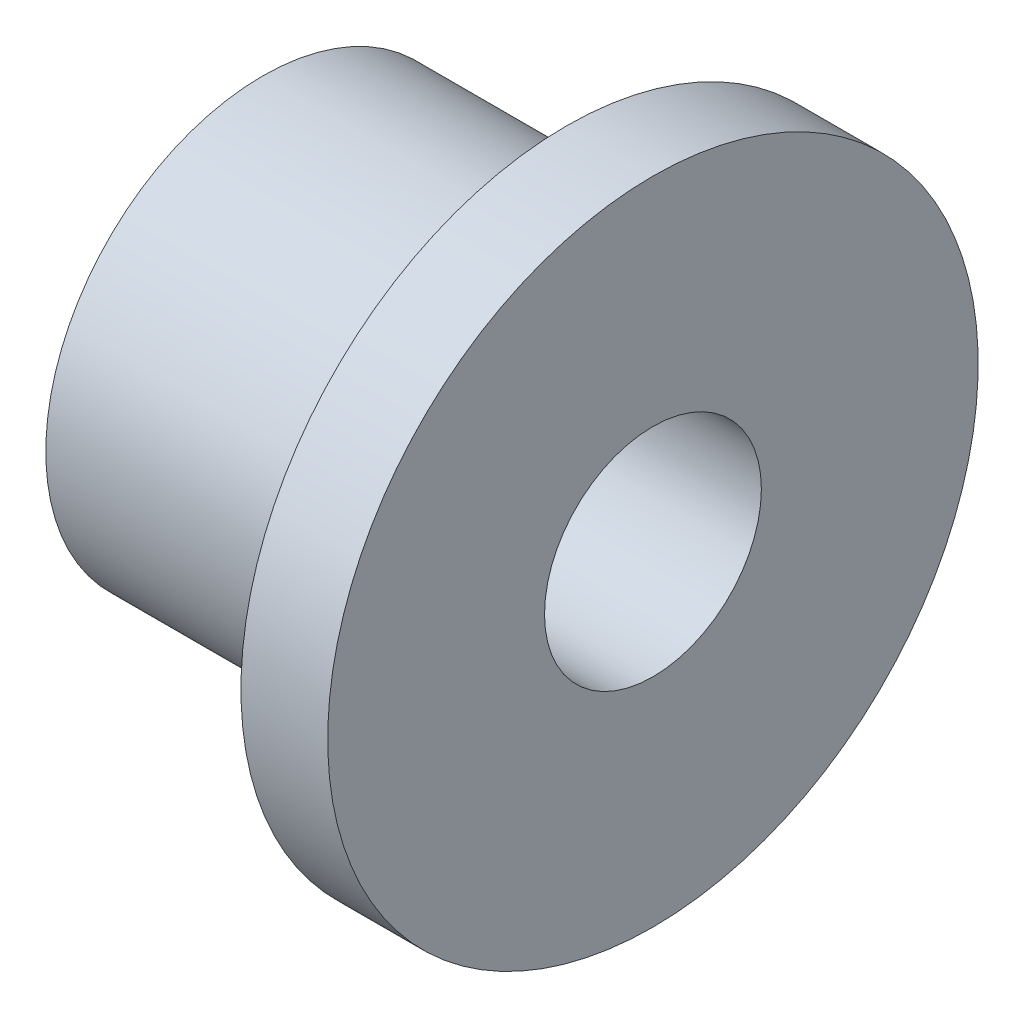
ISO-10303-21;
HEADER;
FILE_DESCRIPTION(('STEP AP214'),'2;1');
FILE_NAME('part.step','',(''),(''),'','','');
FILE_SCHEMA(('AUTOMOTIVE_DESIGN { 1 0 10303 214 1 1 1 1 }'));
ENDSEC;
DATA;
#1=APPLICATION_CONTEXT('core data for automotive mechanical design processes');
#2=APPLICATION_PROTOCOL_DEFINITION('international standard','automotive_design',2000,#1);
#3=PRODUCT_CONTEXT('',#1,'mechanical');
#4=PRODUCT('Part','Part','',(#3));
#5=PRODUCT_RELATED_PRODUCT_CATEGORY('part','',(#4));
#6=PRODUCT_DEFINITION_FORMATION('','',#4);
#7=PRODUCT_DEFINITION_CONTEXT('part definition',#1,'design');
#8=PRODUCT_DEFINITION('design','',#6,#7);
#9=PRODUCT_DEFINITION_SHAPE('','',#8);
#10=(LENGTH_UNIT() NAMED_UNIT(*) SI_UNIT(.MILLI.,.METRE.));
#11=(NAMED_UNIT(*) PLANE_ANGLE_UNIT() SI_UNIT($,.RADIAN.));
#12=(NAMED_UNIT(*) SI_UNIT($,.STERADIAN.) SOLID_ANGLE_UNIT());
#13=UNCERTAINTY_MEASURE_WITH_UNIT(LENGTH_MEASURE(1.E-05),#10,'distance_accuracy_value','');
#14=(GEOMETRIC_REPRESENTATION_CONTEXT(3) GLOBAL_UNCERTAINTY_ASSIGNED_CONTEXT((#13)) GLOBAL_UNIT_ASSIGNED_CONTEXT((#10,
#11,#12)) REPRESENTATION_CONTEXT('',''));
#15=CARTESIAN_POINT('',(0.,0.,0.));
#16=DIRECTION('',(0.,0.,1.));
#17=DIRECTION('',(1.,0.,0.));
#18=AXIS2_PLACEMENT_3D('',#15,#16,#17);
#19=CARTESIAN_POINT('',(35.,20.,0.));
#20=DIRECTION('',(-1.,0.,0.));
#21=DIRECTION('',(0.,-1.,0.));
#22=AXIS2_PLACEMENT_3D('',#19,#20,#21);
#23=PLANE('',#22);
#24=CARTESIAN_POINT('',(35.,20.,0.));
#25=DIRECTION('',(-1.,0.,0.));
#26=DIRECTION('',(0.,-1.,0.));
#27=AXIS2_PLACEMENT_3D('',#24,#25,#26);
#28=CIRCLE('',#27,7.5);
#29=CARTESIAN_POINT('',(35.,12.5,0.));
#30=VERTEX_POINT('',#29);
#31=EDGE_CURVE('E10',#30,#30,#28,.T.);
#32=ORIENTED_EDGE('',*,*,#31,.T.);
#33=EDGE_LOOP('',(#32));
#34=FACE_BOUND('',#33,.T.);
#35=CARTESIAN_POINT('',(35.,20.,0.));
#36=DIRECTION('',(-1.,0.,0.));
#37=DIRECTION('',(0.,-1.,0.));
#38=AXIS2_PLACEMENT_3D('',#35,#36,#37);
#39=CIRCLE('',#38,5.);
#40=CARTESIAN_POINT('',(35.,15.,0.));
#41=VERTEX_POINT('',#40);
#42=EDGE_CURVE('E47',#41,#41,#39,.T.);
#43=ORIENTED_EDGE('',*,*,#42,.F.);
#44=EDGE_LOOP('',(#43));
#45=FACE_BOUND('',#44,.T.);
#46=ADVANCED_FACE('F31',(#34,#45),#23,.T.);
#47=CARTESIAN_POINT('',(37.,20.,0.));
#48=DIRECTION('',(-1.,0.,0.));
#49=DIRECTION('',(0.,-1.,0.));
#50=AXIS2_PLACEMENT_3D('',#47,#48,#49);
#51=PLANE('',#50);
#52=CARTESIAN_POINT('',(37.,20.,0.));
#53=DIRECTION('',(-1.,0.,0.));
#54=DIRECTION('',(0.,-1.,0.));
#55=AXIS2_PLACEMENT_3D('',#52,#53,#54);
#56=CIRCLE('',#55,7.5);
#57=CARTESIAN_POINT('',(37.,12.5,0.));
#58=VERTEX_POINT('',#57);
#59=EDGE_CURVE('E35',#58,#58,#56,.T.);
#60=ORIENTED_EDGE('',*,*,#59,.F.);
#61=EDGE_LOOP('',(#60));
#62=FACE_BOUND('',#61,.T.);
#63=CARTESIAN_POINT('',(37.,20.,0.));
#64=DIRECTION('',(-1.,0.,0.));
#65=DIRECTION('',(0.,-1.,0.));
#66=AXIS2_PLACEMENT_3D('',#63,#64,#65);
#67=CIRCLE('',#66,2.5);
#68=CARTESIAN_POINT('',(37.,17.5,0.));
#69=VERTEX_POINT('',#68);
#70=EDGE_CURVE('E42',#69,#69,#67,.T.);
#71=ORIENTED_EDGE('',*,*,#70,.T.);
#72=EDGE_LOOP('',(#71));
#73=FACE_BOUND('',#72,.T.);
#74=ADVANCED_FACE('F72',(#62,#73),#51,.F.);
#75=CARTESIAN_POINT('',(35.,20.,0.));
#76=DIRECTION('',(1.,0.,0.));
#77=DIRECTION('',(0.,1.,0.));
#78=AXIS2_PLACEMENT_3D('',#75,#76,#77);
#79=CYLINDRICAL_SURFACE('',#78,7.5);
#80=ORIENTED_EDGE('',*,*,#31,.F.);
#81=EDGE_LOOP('',(#80));
#82=FACE_BOUND('',#81,.T.);
#83=ORIENTED_EDGE('',*,*,#59,.T.);
#84=EDGE_LOOP('',(#83));
#85=FACE_BOUND('',#84,.T.);
#86=ADVANCED_FACE('F33',(#82,#85),#79,.T.);
#87=CARTESIAN_POINT('',(35.,20.,0.));
#88=DIRECTION('',(1.,0.,0.));
#89=DIRECTION('',(0.,1.,0.));
#90=AXIS2_PLACEMENT_3D('',#87,#88,#89);
#91=CYLINDRICAL_SURFACE('',#90,2.5);
#92=ORIENTED_EDGE('',*,*,#70,.F.);
#93=EDGE_LOOP('',(#92));
#94=FACE_BOUND('',#93,.T.);
#95=CARTESIAN_POINT('',(28.,20.,0.));
#96=DIRECTION('',(-1.,0.,0.));
#97=DIRECTION('',(0.,-1.,0.));
#98=AXIS2_PLACEMENT_3D('',#95,#96,#97);
#99=CIRCLE('',#98,2.5);
#100=CARTESIAN_POINT('',(28.,17.5,0.));
#101=VERTEX_POINT('',#100);
#102=EDGE_CURVE('E50',#101,#101,#99,.T.);
#103=ORIENTED_EDGE('',*,*,#102,.T.);
#104=EDGE_LOOP('',(#103));
#105=FACE_BOUND('',#104,.T.);
#106=ADVANCED_FACE('F56',(#94,#105),#91,.F.);
#107=CARTESIAN_POINT('',(28.,20.,0.));
#108=DIRECTION('',(-1.,0.,0.));
#109=DIRECTION('',(0.,-1.,0.));
#110=AXIS2_PLACEMENT_3D('',#107,#108,#109);
#111=PLANE('',#110);
#112=CARTESIAN_POINT('',(28.,20.,0.));
#113=DIRECTION('',(-1.,0.,0.));
#114=DIRECTION('',(0.,-1.,0.));
#115=AXIS2_PLACEMENT_3D('',#112,#113,#114);
#116=CIRCLE('',#115,5.);
#117=CARTESIAN_POINT('',(28.,15.,0.));
#118=VERTEX_POINT('',#117);
#119=EDGE_CURVE('E46',#118,#118,#116,.T.);
#120=ORIENTED_EDGE('',*,*,#119,.T.);
#121=EDGE_LOOP('',(#120));
#122=FACE_BOUND('',#121,.T.);
#123=ORIENTED_EDGE('',*,*,#102,.F.);
#124=EDGE_LOOP('',(#123));
#125=FACE_BOUND('',#124,.T.);
#126=ADVANCED_FACE('F58',(#122,#125),#111,.T.);
#127=CARTESIAN_POINT('',(28.,20.,0.));
#128=DIRECTION('',(1.,0.,0.));
#129=DIRECTION('',(0.,1.,0.));
#130=AXIS2_PLACEMENT_3D('',#127,#128,#129);
#131=CYLINDRICAL_SURFACE('',#130,5.);
#132=ORIENTED_EDGE('',*,*,#119,.F.);
#133=EDGE_LOOP('',(#132));
#134=FACE_BOUND('',#133,.T.);
#135=ORIENTED_EDGE('',*,*,#42,.T.);
#136=EDGE_LOOP('',(#135));
#137=FACE_BOUND('',#136,.T.);
#138=ADVANCED_FACE('F60',(#134,#137),#131,.T.);
#139=CLOSED_SHELL('',(#46,#74,#86,#106,#126,#138));
#140=MANIFOLD_SOLID_BREP('B2',#139);
#141=ADVANCED_BREP_SHAPE_REPRESENTATION('',(#18,#140),#14);
#142=SHAPE_DEFINITION_REPRESENTATION(#9,#141);
ENDSEC;
END-ISO-10303-21;
